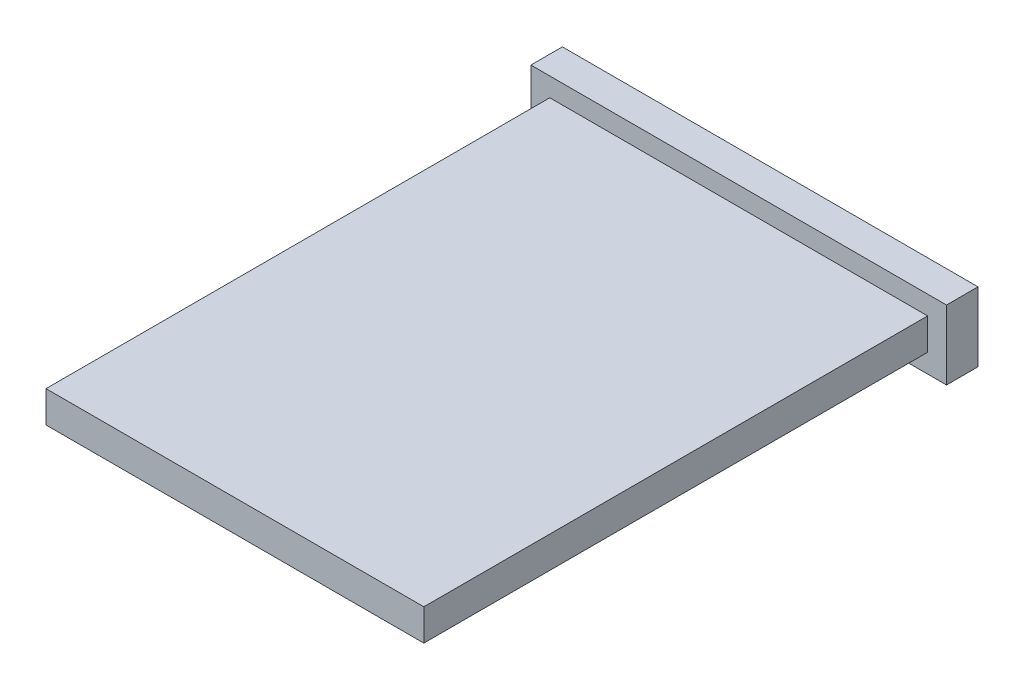
ISO-10303-21;
HEADER;
FILE_DESCRIPTION(('STEP AP214'),'2;1');
FILE_NAME('part.step','',(''),(''),'','','');
FILE_SCHEMA(('AUTOMOTIVE_DESIGN { 1 0 10303 214 1 1 1 1 }'));
ENDSEC;
DATA;
#1=APPLICATION_CONTEXT('core data for automotive mechanical design processes');
#2=APPLICATION_PROTOCOL_DEFINITION('international standard','automotive_design',2000,#1);
#3=PRODUCT_CONTEXT('',#1,'mechanical');
#4=PRODUCT('Part','Part','',(#3));
#5=PRODUCT_RELATED_PRODUCT_CATEGORY('part','',(#4));
#6=PRODUCT_DEFINITION_FORMATION('','',#4);
#7=PRODUCT_DEFINITION_CONTEXT('part definition',#1,'design');
#8=PRODUCT_DEFINITION('design','',#6,#7);
#9=PRODUCT_DEFINITION_SHAPE('','',#8);
#10=(LENGTH_UNIT() NAMED_UNIT(*) SI_UNIT(.MILLI.,.METRE.));
#11=(NAMED_UNIT(*) PLANE_ANGLE_UNIT() SI_UNIT($,.RADIAN.));
#12=(NAMED_UNIT(*) SI_UNIT($,.STERADIAN.) SOLID_ANGLE_UNIT());
#13=UNCERTAINTY_MEASURE_WITH_UNIT(LENGTH_MEASURE(1.E-05),#10,'distance_accuracy_value','');
#14=(GEOMETRIC_REPRESENTATION_CONTEXT(3) GLOBAL_UNCERTAINTY_ASSIGNED_CONTEXT((#13)) GLOBAL_UNIT_ASSIGNED_CONTEXT((#10,
#11,#12)) REPRESENTATION_CONTEXT('',''));
#15=CARTESIAN_POINT('',(0.,0.,0.));
#16=DIRECTION('',(0.,0.,1.));
#17=DIRECTION('',(1.,0.,0.));
#18=AXIS2_PLACEMENT_3D('',#15,#16,#17);
#19=CARTESIAN_POINT('',(0.,5.,0.));
#20=DIRECTION('',(1.,0.,0.));
#21=DIRECTION('',(0.,0.,-1.));
#22=AXIS2_PLACEMENT_3D('',#19,#20,#21);
#23=PLANE('',#22);
#24=DIRECTION('',(0.,0.,1.));
#25=VECTOR('',#24,1.);
#26=CARTESIAN_POINT('',(0.,0.,0.));
#27=LINE('',#26,#25);
#28=CARTESIAN_POINT('',(0.,0.,-80.));
#29=VERTEX_POINT('',#28);
#30=CARTESIAN_POINT('',(0.,0.,0.));
#31=VERTEX_POINT('',#30);
#32=EDGE_CURVE('E129',#29,#31,#27,.T.);
#33=ORIENTED_EDGE('',*,*,#32,.T.);
#34=DIRECTION('',(0.,-1.,0.));
#35=VECTOR('',#34,1.);
#36=CARTESIAN_POINT('',(0.,5.,0.));
#37=LINE('',#36,#35);
#38=CARTESIAN_POINT('',(0.,5.,0.));
#39=VERTEX_POINT('',#38);
#40=EDGE_CURVE('E11',#39,#31,#37,.T.);
#41=ORIENTED_EDGE('',*,*,#40,.F.);
#42=DIRECTION('',(0.,0.,1.));
#43=VECTOR('',#42,1.);
#44=CARTESIAN_POINT('',(0.,5.,0.));
#45=LINE('',#44,#43);
#46=CARTESIAN_POINT('',(0.,5.,-80.));
#47=VERTEX_POINT('',#46);
#48=EDGE_CURVE('E137',#47,#39,#45,.T.);
#49=ORIENTED_EDGE('',*,*,#48,.F.);
#50=DIRECTION('',(0.,-1.,0.));
#51=VECTOR('',#50,1.);
#52=CARTESIAN_POINT('',(0.,5.,-80.));
#53=LINE('',#52,#51);
#54=EDGE_CURVE('E143',#47,#29,#53,.T.);
#55=ORIENTED_EDGE('',*,*,#54,.T.);
#56=EDGE_LOOP('',(#33,#41,#49,#55));
#57=FACE_BOUND('',#56,.T.);
#58=ADVANCED_FACE('F33',(#57),#23,.F.);
#59=CARTESIAN_POINT('',(0.,5.,0.));
#60=DIRECTION('',(0.,0.,-1.));
#61=DIRECTION('',(-1.,0.,0.));
#62=AXIS2_PLACEMENT_3D('',#59,#60,#61);
#63=PLANE('',#62);
#64=DIRECTION('',(1.,0.,0.));
#65=VECTOR('',#64,1.);
#66=CARTESIAN_POINT('',(0.,0.,0.));
#67=LINE('',#66,#65);
#68=CARTESIAN_POINT('',(60.,0.,0.));
#69=VERTEX_POINT('',#68);
#70=EDGE_CURVE('E62',#31,#69,#67,.T.);
#71=ORIENTED_EDGE('',*,*,#70,.T.);
#72=DIRECTION('',(0.,-1.,0.));
#73=VECTOR('',#72,1.);
#74=CARTESIAN_POINT('',(60.,5.,0.));
#75=LINE('',#74,#73);
#76=CARTESIAN_POINT('',(60.,5.,0.));
#77=VERTEX_POINT('',#76);
#78=EDGE_CURVE('E41',#77,#69,#75,.T.);
#79=ORIENTED_EDGE('',*,*,#78,.F.);
#80=DIRECTION('',(1.,0.,0.));
#81=VECTOR('',#80,1.);
#82=CARTESIAN_POINT('',(0.,5.,0.));
#83=LINE('',#82,#81);
#84=EDGE_CURVE('E74',#39,#77,#83,.T.);
#85=ORIENTED_EDGE('',*,*,#84,.F.);
#86=ORIENTED_EDGE('',*,*,#40,.T.);
#87=EDGE_LOOP('',(#71,#79,#85,#86));
#88=FACE_BOUND('',#87,.T.);
#89=ADVANCED_FACE('F170',(#88),#63,.F.);
#90=CARTESIAN_POINT('',(60.,5.,0.));
#91=DIRECTION('',(-1.,0.,0.));
#92=DIRECTION('',(0.,0.,1.));
#93=AXIS2_PLACEMENT_3D('',#90,#91,#92);
#94=PLANE('',#93);
#95=DIRECTION('',(0.,0.,-1.));
#96=VECTOR('',#95,1.);
#97=CARTESIAN_POINT('',(60.,0.,0.));
#98=LINE('',#97,#96);
#99=CARTESIAN_POINT('',(60.,0.,-80.));
#100=VERTEX_POINT('',#99);
#101=EDGE_CURVE('E69',#69,#100,#98,.T.);
#102=ORIENTED_EDGE('',*,*,#101,.T.);
#103=DIRECTION('',(0.,-1.,0.));
#104=VECTOR('',#103,1.);
#105=CARTESIAN_POINT('',(60.,5.,-80.));
#106=LINE('',#105,#104);
#107=CARTESIAN_POINT('',(60.,5.,-80.));
#108=VERTEX_POINT('',#107);
#109=EDGE_CURVE('E151',#108,#100,#106,.T.);
#110=ORIENTED_EDGE('',*,*,#109,.F.);
#111=DIRECTION('',(0.,0.,-1.));
#112=VECTOR('',#111,1.);
#113=CARTESIAN_POINT('',(60.,5.,0.));
#114=LINE('',#113,#112);
#115=EDGE_CURVE('E141',#77,#108,#114,.T.);
#116=ORIENTED_EDGE('',*,*,#115,.F.);
#117=ORIENTED_EDGE('',*,*,#78,.T.);
#118=EDGE_LOOP('',(#102,#110,#116,#117));
#119=FACE_BOUND('',#118,.T.);
#120=ADVANCED_FACE('F154',(#119),#94,.F.);
#121=CARTESIAN_POINT('',(0.,5.,0.));
#122=DIRECTION('',(0.,-1.,0.));
#123=DIRECTION('',(0.,0.,-1.));
#124=AXIS2_PLACEMENT_3D('',#121,#122,#123);
#125=PLANE('',#124);
#126=ORIENTED_EDGE('',*,*,#48,.T.);
#127=ORIENTED_EDGE('',*,*,#84,.T.);
#128=ORIENTED_EDGE('',*,*,#115,.T.);
#129=DIRECTION('',(-1.,0.,0.));
#130=VECTOR('',#129,1.);
#131=CARTESIAN_POINT('',(0.,5.,-80.));
#132=LINE('',#131,#130);
#133=EDGE_CURVE('E49',#108,#47,#132,.T.);
#134=ORIENTED_EDGE('',*,*,#133,.T.);
#135=EDGE_LOOP('',(#126,#127,#128,#134));
#136=FACE_BOUND('',#135,.T.);
#137=ADVANCED_FACE('F162',(#136),#125,.F.);
#138=CARTESIAN_POINT('',(0.,0.,0.));
#139=DIRECTION('',(0.,-1.,0.));
#140=DIRECTION('',(0.,0.,-1.));
#141=AXIS2_PLACEMENT_3D('',#138,#139,#140);
#142=PLANE('',#141);
#143=ORIENTED_EDGE('',*,*,#32,.F.);
#144=DIRECTION('',(-1.,0.,0.));
#145=VECTOR('',#144,1.);
#146=CARTESIAN_POINT('',(0.,0.,-80.));
#147=LINE('',#146,#145);
#148=EDGE_CURVE('E139',#100,#29,#147,.T.);
#149=ORIENTED_EDGE('',*,*,#148,.F.);
#150=ORIENTED_EDGE('',*,*,#101,.F.);
#151=ORIENTED_EDGE('',*,*,#70,.F.);
#152=EDGE_LOOP('',(#143,#149,#150,#151));
#153=FACE_BOUND('',#152,.T.);
#154=ADVANCED_FACE('F156',(#153),#142,.T.);
#155=CARTESIAN_POINT('',(0.,0.,-80.));
#156=DIRECTION('',(0.,0.,-1.));
#157=DIRECTION('',(-1.,0.,0.));
#158=AXIS2_PLACEMENT_3D('',#155,#156,#157);
#159=PLANE('',#158);
#160=DIRECTION('',(-1.,0.,0.));
#161=VECTOR('',#160,1.);
#162=CARTESIAN_POINT('',(63.,-3.,-80.));
#163=LINE('',#162,#161);
#164=CARTESIAN_POINT('',(63.,-3.,-80.));
#165=VERTEX_POINT('',#164);
#166=CARTESIAN_POINT('',(-3.,-3.,-80.));
#167=VERTEX_POINT('',#166);
#168=EDGE_CURVE('E128',#165,#167,#163,.T.);
#169=ORIENTED_EDGE('',*,*,#168,.F.);
#170=DIRECTION('',(0.,-1.,0.));
#171=VECTOR('',#170,1.);
#172=CARTESIAN_POINT('',(63.,8.,-80.));
#173=LINE('',#172,#171);
#174=CARTESIAN_POINT('',(63.,8.,-80.));
#175=VERTEX_POINT('',#174);
#176=EDGE_CURVE('E124',#175,#165,#173,.T.);
#177=ORIENTED_EDGE('',*,*,#176,.F.);
#178=DIRECTION('',(1.,0.,0.));
#179=VECTOR('',#178,1.);
#180=CARTESIAN_POINT('',(-3.,8.,-80.));
#181=LINE('',#180,#179);
#182=CARTESIAN_POINT('',(-3.,8.,-80.));
#183=VERTEX_POINT('',#182);
#184=EDGE_CURVE('E256',#183,#175,#181,.T.);
#185=ORIENTED_EDGE('',*,*,#184,.F.);
#186=DIRECTION('',(0.,1.,0.));
#187=VECTOR('',#186,1.);
#188=CARTESIAN_POINT('',(-3.,-3.,-80.));
#189=LINE('',#188,#187);
#190=EDGE_CURVE('E259',#167,#183,#189,.T.);
#191=ORIENTED_EDGE('',*,*,#190,.F.);
#192=EDGE_LOOP('',(#169,#177,#185,#191));
#193=FACE_BOUND('',#192,.T.);
#194=ORIENTED_EDGE('',*,*,#54,.F.);
#195=ORIENTED_EDGE('',*,*,#133,.F.);
#196=ORIENTED_EDGE('',*,*,#109,.T.);
#197=ORIENTED_EDGE('',*,*,#148,.T.);
#198=EDGE_LOOP('',(#194,#195,#196,#197));
#199=FACE_BOUND('',#198,.T.);
#200=ADVANCED_FACE('F159',(#193,#199),#159,.F.);
#201=CARTESIAN_POINT('',(63.,-3.,-85.));
#202=DIRECTION('',(0.,1.,0.));
#203=DIRECTION('',(0.,0.,1.));
#204=AXIS2_PLACEMENT_3D('',#201,#202,#203);
#205=PLANE('',#204);
#206=ORIENTED_EDGE('',*,*,#168,.T.);
#207=DIRECTION('',(0.,0.,1.));
#208=VECTOR('',#207,1.);
#209=CARTESIAN_POINT('',(-3.,-3.,-85.));
#210=LINE('',#209,#208);
#211=CARTESIAN_POINT('',(-3.,-3.,-85.));
#212=VERTEX_POINT('',#211);
#213=EDGE_CURVE('E108',#212,#167,#210,.T.);
#214=ORIENTED_EDGE('',*,*,#213,.F.);
#215=DIRECTION('',(-1.,0.,0.));
#216=VECTOR('',#215,1.);
#217=CARTESIAN_POINT('',(63.,-3.,-85.));
#218=LINE('',#217,#216);
#219=CARTESIAN_POINT('',(63.,-3.,-85.));
#220=VERTEX_POINT('',#219);
#221=EDGE_CURVE('E115',#220,#212,#218,.T.);
#222=ORIENTED_EDGE('',*,*,#221,.F.);
#223=DIRECTION('',(0.,0.,1.));
#224=VECTOR('',#223,1.);
#225=CARTESIAN_POINT('',(63.,-3.,-85.));
#226=LINE('',#225,#224);
#227=EDGE_CURVE('E253',#220,#165,#226,.T.);
#228=ORIENTED_EDGE('',*,*,#227,.T.);
#229=EDGE_LOOP('',(#206,#214,#222,#228));
#230=FACE_BOUND('',#229,.T.);
#231=ADVANCED_FACE('F126',(#230),#205,.F.);
#232=CARTESIAN_POINT('',(-3.,-3.,-85.));
#233=DIRECTION('',(1.,0.,0.));
#234=DIRECTION('',(0.,0.,-1.));
#235=AXIS2_PLACEMENT_3D('',#232,#233,#234);
#236=PLANE('',#235);
#237=ORIENTED_EDGE('',*,*,#190,.T.);
#238=DIRECTION('',(0.,0.,1.));
#239=VECTOR('',#238,1.);
#240=CARTESIAN_POINT('',(-3.,8.,-85.));
#241=LINE('',#240,#239);
#242=CARTESIAN_POINT('',(-3.,8.,-85.));
#243=VERTEX_POINT('',#242);
#244=EDGE_CURVE('E111',#243,#183,#241,.T.);
#245=ORIENTED_EDGE('',*,*,#244,.F.);
#246=DIRECTION('',(0.,1.,0.));
#247=VECTOR('',#246,1.);
#248=CARTESIAN_POINT('',(-3.,-3.,-85.));
#249=LINE('',#248,#247);
#250=EDGE_CURVE('E104',#212,#243,#249,.T.);
#251=ORIENTED_EDGE('',*,*,#250,.F.);
#252=ORIENTED_EDGE('',*,*,#213,.T.);
#253=EDGE_LOOP('',(#237,#245,#251,#252));
#254=FACE_BOUND('',#253,.T.);
#255=ADVANCED_FACE('F106',(#254),#236,.F.);
#256=CARTESIAN_POINT('',(-3.,8.,-85.));
#257=DIRECTION('',(0.,-1.,0.));
#258=DIRECTION('',(0.,0.,-1.));
#259=AXIS2_PLACEMENT_3D('',#256,#257,#258);
#260=PLANE('',#259);
#261=ORIENTED_EDGE('',*,*,#184,.T.);
#262=DIRECTION('',(0.,0.,1.));
#263=VECTOR('',#262,1.);
#264=CARTESIAN_POINT('',(63.,8.,-85.));
#265=LINE('',#264,#263);
#266=CARTESIAN_POINT('',(63.,8.,-85.));
#267=VERTEX_POINT('',#266);
#268=EDGE_CURVE('E133',#267,#175,#265,.T.);
#269=ORIENTED_EDGE('',*,*,#268,.F.);
#270=DIRECTION('',(1.,0.,0.));
#271=VECTOR('',#270,1.);
#272=CARTESIAN_POINT('',(-3.,8.,-85.));
#273=LINE('',#272,#271);
#274=EDGE_CURVE('E114',#243,#267,#273,.T.);
#275=ORIENTED_EDGE('',*,*,#274,.F.);
#276=ORIENTED_EDGE('',*,*,#244,.T.);
#277=EDGE_LOOP('',(#261,#269,#275,#276));
#278=FACE_BOUND('',#277,.T.);
#279=ADVANCED_FACE('F220',(#278),#260,.F.);
#280=CARTESIAN_POINT('',(63.,8.,-85.));
#281=DIRECTION('',(-1.,0.,0.));
#282=DIRECTION('',(0.,0.,1.));
#283=AXIS2_PLACEMENT_3D('',#280,#281,#282);
#284=PLANE('',#283);
#285=ORIENTED_EDGE('',*,*,#176,.T.);
#286=ORIENTED_EDGE('',*,*,#227,.F.);
#287=DIRECTION('',(0.,-1.,0.));
#288=VECTOR('',#287,1.);
#289=CARTESIAN_POINT('',(63.,8.,-85.));
#290=LINE('',#289,#288);
#291=EDGE_CURVE('E120',#267,#220,#290,.T.);
#292=ORIENTED_EDGE('',*,*,#291,.F.);
#293=ORIENTED_EDGE('',*,*,#268,.T.);
#294=EDGE_LOOP('',(#285,#286,#292,#293));
#295=FACE_BOUND('',#294,.T.);
#296=ADVANCED_FACE('F229',(#295),#284,.F.);
#297=CARTESIAN_POINT('',(0.,0.,-85.));
#298=DIRECTION('',(0.,0.,-1.));
#299=DIRECTION('',(-1.,0.,0.));
#300=AXIS2_PLACEMENT_3D('',#297,#298,#299);
#301=PLANE('',#300);
#302=ORIENTED_EDGE('',*,*,#221,.T.);
#303=ORIENTED_EDGE('',*,*,#250,.T.);
#304=ORIENTED_EDGE('',*,*,#274,.T.);
#305=ORIENTED_EDGE('',*,*,#291,.T.);
#306=EDGE_LOOP('',(#302,#303,#304,#305));
#307=FACE_BOUND('',#306,.T.);
#308=ADVANCED_FACE('F118',(#307),#301,.T.);
#309=CLOSED_SHELL('',(#58,#89,#120,#137,#154,#200,#231,#255,#279,#296,#308));
#310=MANIFOLD_SOLID_BREP('B2',#309);
#311=ADVANCED_BREP_SHAPE_REPRESENTATION('',(#18,#310),#14);
#312=SHAPE_DEFINITION_REPRESENTATION(#9,#311);
ENDSEC;
END-ISO-10303-21;
